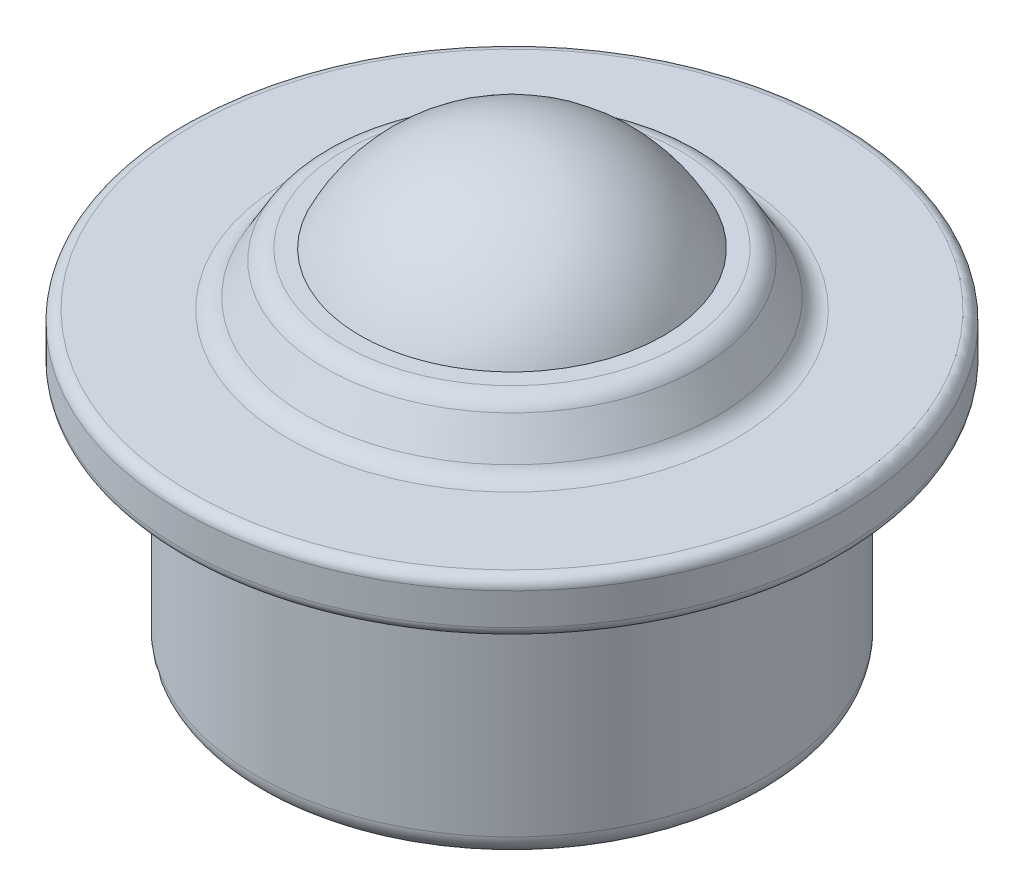
ISO-10303-21;
HEADER;
FILE_DESCRIPTION(('STEP AP214'),'2;1');
FILE_NAME('part.step','',(''),(''),'','','');
FILE_SCHEMA(('AUTOMOTIVE_DESIGN { 1 0 10303 214 1 1 1 1 }'));
ENDSEC;
DATA;
#1=APPLICATION_CONTEXT('core data for automotive mechanical design processes');
#2=APPLICATION_PROTOCOL_DEFINITION('international standard','automotive_design',2000,#1);
#3=PRODUCT_CONTEXT('',#1,'mechanical');
#4=PRODUCT('Part','Part','',(#3));
#5=PRODUCT_RELATED_PRODUCT_CATEGORY('part','',(#4));
#6=PRODUCT_DEFINITION_FORMATION('','',#4);
#7=PRODUCT_DEFINITION_CONTEXT('part definition',#1,'design');
#8=PRODUCT_DEFINITION('design','',#6,#7);
#9=PRODUCT_DEFINITION_SHAPE('','',#8);
#10=(LENGTH_UNIT() NAMED_UNIT(*) SI_UNIT(.MILLI.,.METRE.));
#11=(NAMED_UNIT(*) PLANE_ANGLE_UNIT() SI_UNIT($,.RADIAN.));
#12=(NAMED_UNIT(*) SI_UNIT($,.STERADIAN.) SOLID_ANGLE_UNIT());
#13=UNCERTAINTY_MEASURE_WITH_UNIT(LENGTH_MEASURE(1.E-05),#10,'distance_accuracy_value','');
#14=(GEOMETRIC_REPRESENTATION_CONTEXT(3) GLOBAL_UNCERTAINTY_ASSIGNED_CONTEXT((#13)) GLOBAL_UNIT_ASSIGNED_CONTEXT((#10,
#11,#12)) REPRESENTATION_CONTEXT('',''));
#15=CARTESIAN_POINT('',(0.,0.,0.));
#16=DIRECTION('',(0.,0.,1.));
#17=DIRECTION('',(1.,0.,0.));
#18=AXIS2_PLACEMENT_3D('',#15,#16,#17);
#19=CARTESIAN_POINT('',(0.,11.5,0.));
#20=DIRECTION('',(0.,-1.,0.));
#21=DIRECTION('',(0.,0.,-1.));
#22=AXIS2_PLACEMENT_3D('',#19,#20,#21);
#23=PLANE('',#22);
#24=CARTESIAN_POINT('',(0.,11.5,0.));
#25=DIRECTION('',(0.,-1.,0.));
#26=DIRECTION('',(0.,0.,-1.));
#27=AXIS2_PLACEMENT_3D('',#24,#25,#26);
#28=CIRCLE('',#27,15.);
#29=CARTESIAN_POINT('',(0.,11.5,-15.));
#30=VERTEX_POINT('',#29);
#31=EDGE_CURVE('E71',#30,#30,#28,.T.);
#32=ORIENTED_EDGE('',*,*,#31,.T.);
#33=EDGE_LOOP('',(#32));
#34=FACE_BOUND('',#33,.T.);
#35=CARTESIAN_POINT('',(0.,11.5,0.));
#36=DIRECTION('',(0.,-1.,0.));
#37=DIRECTION('',(0.,0.,-1.));
#38=AXIS2_PLACEMENT_3D('',#35,#36,#37);
#39=CIRCLE('',#38,12.);
#40=CARTESIAN_POINT('',(0.,11.5,-12.));
#41=VERTEX_POINT('',#40);
#42=EDGE_CURVE('E231',#41,#41,#39,.T.);
#43=ORIENTED_EDGE('',*,*,#42,.F.);
#44=EDGE_LOOP('',(#43));
#45=FACE_BOUND('',#44,.T.);
#46=ADVANCED_FACE('F42',(#34,#45),#23,.T.);
#47=CARTESIAN_POINT('',(0.,13.1,0.));
#48=DIRECTION('',(0.275025484031661,0.22901575812674,0.933762692370383));
#49=DIRECTION('',(-0.209422371492755,-0.933625492429608,0.290664256839267));
#50=AXIS2_PLACEMENT_3D('',#47,#48,#49);
#51=SPHERICAL_SURFACE('',#50,7.90000000000001);
#52=CARTESIAN_POINT('',(0.,16.5,0.));
#53=DIRECTION('',(0.,1.,0.));
#54=DIRECTION('',(1.,0.,0.));
#55=AXIS2_PLACEMENT_3D('',#52,#53,#54);
#56=CIRCLE('',#55,7.13091859440283);
#57=CARTESIAN_POINT('',(7.13091859440283,16.5,0.));
#58=VERTEX_POINT('',#57);
#59=EDGE_CURVE('E80',#58,#58,#56,.T.);
#60=ORIENTED_EDGE('',*,*,#59,.T.);
#61=EDGE_LOOP('',(#60));
#62=FACE_BOUND('',#61,.T.);
#63=ADVANCED_FACE('F115',(#62),#51,.T.);
#64=CARTESIAN_POINT('',(7.5267841626066,16.5,0.));
#65=DIRECTION('',(0.,1.,0.));
#66=DIRECTION('',(0.,0.,1.));
#67=AXIS2_PLACEMENT_3D('',#64,#65,#66);
#68=PLANE('',#67);
#69=CARTESIAN_POINT('',(0.,16.5,0.));
#70=DIRECTION('',(0.,1.,0.));
#71=DIRECTION('',(0.,0.,1.));
#72=AXIS2_PLACEMENT_3D('',#69,#70,#71);
#73=CIRCLE('',#72,7.92264973081035);
#74=CARTESIAN_POINT('',(0.,16.5,7.92264973081035));
#75=VERTEX_POINT('',#74);
#76=EDGE_CURVE('E11',#75,#75,#73,.T.);
#77=ORIENTED_EDGE('',*,*,#76,.T.);
#78=EDGE_LOOP('',(#77));
#79=FACE_BOUND('',#78,.T.);
#80=ORIENTED_EDGE('',*,*,#59,.F.);
#81=EDGE_LOOP('',(#80));
#82=FACE_BOUND('',#81,.T.);
#83=ADVANCED_FACE('F91',(#79,#82),#68,.T.);
#84=DIRECTION('',(-0.5,0.866025403784439,0.));
#85=VECTOR('',#84,1.);
#86=CARTESIAN_POINT('',(9.22168783648703,15.25,0.));
#87=LINE('',#86,#85);
#88=CARTESIAN_POINT('',(0.,31.2224318643354,0.));
#89=DIRECTION('',(0.,-1.,0.));
#90=AXIS1_PLACEMENT('',#88,#89);
#91=SURFACE_OF_REVOLUTION('',#87,#90);
#92=CARTESIAN_POINT('',(0.,14.5,0.));
#93=DIRECTION('',(0.,-1.,0.));
#94=DIRECTION('',(0.,0.,-1.));
#95=AXIS2_PLACEMENT_3D('',#92,#93,#94);
#96=CIRCLE('',#95,9.65470053837924);
#97=CARTESIAN_POINT('',(0.,14.5,-9.65470053837924));
#98=VERTEX_POINT('',#97);
#99=EDGE_CURVE('E62',#98,#98,#96,.F.);
#100=ORIENTED_EDGE('',*,*,#99,.T.);
#101=EDGE_LOOP('',(#100));
#102=FACE_BOUND('',#101,.T.);
#103=CARTESIAN_POINT('',(0.,16.,0.));
#104=DIRECTION('',(0.,-1.,0.));
#105=DIRECTION('',(0.,0.,-1.));
#106=AXIS2_PLACEMENT_3D('',#103,#104,#105);
#107=CIRCLE('',#106,8.78867513459482);
#108=CARTESIAN_POINT('',(0.,16.,-8.78867513459482));
#109=VERTEX_POINT('',#108);
#110=EDGE_CURVE('E65',#109,#109,#107,.T.);
#111=ORIENTED_EDGE('',*,*,#110,.T.);
#112=EDGE_LOOP('',(#111));
#113=FACE_BOUND('',#112,.T.);
#114=ADVANCED_FACE('F86',(#102,#113),#91,.F.);
#115=CARTESIAN_POINT('',(0.,11.5,0.));
#116=DIRECTION('',(0.,1.,0.));
#117=DIRECTION('',(0.,0.,1.));
#118=AXIS2_PLACEMENT_3D('',#115,#116,#117);
#119=CYLINDRICAL_SURFACE('',#118,15.5);
#120=CARTESIAN_POINT('',(0.,12.,0.));
#121=DIRECTION('',(0.,-1.,0.));
#122=DIRECTION('',(0.,0.,-1.));
#123=AXIS2_PLACEMENT_3D('',#120,#121,#122);
#124=CIRCLE('',#123,15.5);
#125=CARTESIAN_POINT('',(0.,12.,-15.5));
#126=VERTEX_POINT('',#125);
#127=EDGE_CURVE('E74',#126,#126,#124,.F.);
#128=ORIENTED_EDGE('',*,*,#127,.T.);
#129=EDGE_LOOP('',(#128));
#130=FACE_BOUND('',#129,.T.);
#131=CARTESIAN_POINT('',(0.,13.5,0.));
#132=DIRECTION('',(0.,-1.,0.));
#133=DIRECTION('',(0.,0.,-1.));
#134=AXIS2_PLACEMENT_3D('',#131,#132,#133);
#135=CIRCLE('',#134,15.5);
#136=CARTESIAN_POINT('',(0.,13.5,-15.5));
#137=VERTEX_POINT('',#136);
#138=EDGE_CURVE('E77',#137,#137,#135,.T.);
#139=ORIENTED_EDGE('',*,*,#138,.T.);
#140=EDGE_LOOP('',(#139));
#141=FACE_BOUND('',#140,.T.);
#142=ADVANCED_FACE('F90',(#130,#141),#119,.T.);
#143=CARTESIAN_POINT('',(0.,14.,0.));
#144=DIRECTION('',(0.,-1.,0.));
#145=DIRECTION('',(0.,0.,-1.));
#146=AXIS2_PLACEMENT_3D('',#143,#144,#145);
#147=PLANE('',#146);
#148=CARTESIAN_POINT('',(0.,14.,0.));
#149=DIRECTION('',(0.,-1.,0.));
#150=DIRECTION('',(0.,0.,-1.));
#151=AXIS2_PLACEMENT_3D('',#148,#149,#150);
#152=CIRCLE('',#151,10.5207259421637);
#153=CARTESIAN_POINT('',(0.,14.,-10.5207259421637));
#154=VERTEX_POINT('',#153);
#155=EDGE_CURVE('E57',#154,#154,#152,.T.);
#156=ORIENTED_EDGE('',*,*,#155,.T.);
#157=EDGE_LOOP('',(#156));
#158=FACE_BOUND('',#157,.T.);
#159=CARTESIAN_POINT('',(0.,14.,0.));
#160=DIRECTION('',(0.,-1.,0.));
#161=DIRECTION('',(0.,0.,-1.));
#162=AXIS2_PLACEMENT_3D('',#159,#160,#161);
#163=CIRCLE('',#162,15.);
#164=CARTESIAN_POINT('',(0.,14.,-15.));
#165=VERTEX_POINT('',#164);
#166=EDGE_CURVE('E68',#165,#165,#163,.F.);
#167=ORIENTED_EDGE('',*,*,#166,.T.);
#168=EDGE_LOOP('',(#167));
#169=FACE_BOUND('',#168,.T.);
#170=ADVANCED_FACE('F127',(#158,#169),#147,.F.);
#171=CARTESIAN_POINT('',(0.,0.,0.));
#172=DIRECTION('',(0.,1.,0.));
#173=DIRECTION('',(0.,0.,1.));
#174=AXIS2_PLACEMENT_3D('',#171,#172,#173);
#175=CYLINDRICAL_SURFACE('',#174,12.);
#176=CARTESIAN_POINT('',(0.,1.00000000000004,0.));
#177=DIRECTION('',(0.,-1.,0.));
#178=DIRECTION('',(0.,0.,-1.));
#179=AXIS2_PLACEMENT_3D('',#176,#177,#178);
#180=CIRCLE('',#179,12.);
#181=CARTESIAN_POINT('',(0.,1.00000000000004,-12.));
#182=VERTEX_POINT('',#181);
#183=EDGE_CURVE('E49',#182,#182,#180,.F.);
#184=ORIENTED_EDGE('',*,*,#183,.T.);
#185=EDGE_LOOP('',(#184));
#186=FACE_BOUND('',#185,.T.);
#187=ORIENTED_EDGE('',*,*,#42,.T.);
#188=EDGE_LOOP('',(#187));
#189=FACE_BOUND('',#188,.T.);
#190=ADVANCED_FACE('F125',(#186,#189),#175,.T.);
#191=CARTESIAN_POINT('',(0.,0.,0.));
#192=DIRECTION('',(0.,-1.,0.));
#193=DIRECTION('',(0.,0.,-1.));
#194=AXIS2_PLACEMENT_3D('',#191,#192,#193);
#195=PLANE('',#194);
#196=CARTESIAN_POINT('',(0.,0.,0.));
#197=DIRECTION('',(0.,-1.,0.));
#198=DIRECTION('',(0.,0.,-1.));
#199=AXIS2_PLACEMENT_3D('',#196,#197,#198);
#200=CIRCLE('',#199,11.);
#201=CARTESIAN_POINT('',(0.,0.,-11.));
#202=VERTEX_POINT('',#201);
#203=EDGE_CURVE('E53',#202,#202,#200,.T.);
#204=ORIENTED_EDGE('',*,*,#203,.T.);
#205=EDGE_LOOP('',(#204));
#206=FACE_BOUND('',#205,.T.);
#207=ADVANCED_FACE('F98',(#206),#195,.T.);
#208=CARTESIAN_POINT('',(0.,12.,0.));
#209=DIRECTION('',(0.,-1.,0.));
#210=DIRECTION('',(0.,0.,-1.));
#211=AXIS2_PLACEMENT_3D('',#208,#209,#210);
#212=TOROIDAL_SURFACE('',#211,15.,0.500000000000003);
#213=ORIENTED_EDGE('',*,*,#31,.F.);
#214=EDGE_LOOP('',(#213));
#215=FACE_BOUND('',#214,.T.);
#216=ORIENTED_EDGE('',*,*,#127,.F.);
#217=EDGE_LOOP('',(#216));
#218=FACE_BOUND('',#217,.T.);
#219=ADVANCED_FACE('F94',(#215,#218),#212,.T.);
#220=CARTESIAN_POINT('',(0.,13.5,0.));
#221=DIRECTION('',(0.,-1.,0.));
#222=DIRECTION('',(0.,0.,-1.));
#223=AXIS2_PLACEMENT_3D('',#220,#221,#222);
#224=TOROIDAL_SURFACE('',#223,15.,0.500000000000003);
#225=ORIENTED_EDGE('',*,*,#138,.F.);
#226=EDGE_LOOP('',(#225));
#227=FACE_BOUND('',#226,.T.);
#228=ORIENTED_EDGE('',*,*,#166,.F.);
#229=EDGE_LOOP('',(#228));
#230=FACE_BOUND('',#229,.T.);
#231=ADVANCED_FACE('F97',(#227,#230),#224,.T.);
#232=CARTESIAN_POINT('',(0.,15.,0.));
#233=DIRECTION('',(0.,-1.,0.));
#234=DIRECTION('',(0.,0.,-1.));
#235=AXIS2_PLACEMENT_3D('',#232,#233,#234);
#236=TOROIDAL_SURFACE('',#235,10.5207259421637,1.00000000000004);
#237=ORIENTED_EDGE('',*,*,#155,.F.);
#238=EDGE_LOOP('',(#237));
#239=FACE_BOUND('',#238,.T.);
#240=ORIENTED_EDGE('',*,*,#99,.F.);
#241=EDGE_LOOP('',(#240));
#242=FACE_BOUND('',#241,.T.);
#243=ADVANCED_FACE('F102',(#239,#242),#236,.F.);
#244=CARTESIAN_POINT('',(0.,1.00000000000004,0.));
#245=DIRECTION('',(0.,-1.,0.));
#246=DIRECTION('',(0.,0.,-1.));
#247=AXIS2_PLACEMENT_3D('',#244,#245,#246);
#248=TOROIDAL_SURFACE('',#247,11.,1.00000000000004);
#249=ORIENTED_EDGE('',*,*,#183,.F.);
#250=EDGE_LOOP('',(#249));
#251=FACE_BOUND('',#250,.T.);
#252=ORIENTED_EDGE('',*,*,#203,.F.);
#253=EDGE_LOOP('',(#252));
#254=FACE_BOUND('',#253,.T.);
#255=ADVANCED_FACE('F105',(#251,#254),#248,.T.);
#256=CARTESIAN_POINT('',(0.,15.5,0.));
#257=DIRECTION('',(0.,-1.,0.));
#258=DIRECTION('',(0.,0.,-1.));
#259=AXIS2_PLACEMENT_3D('',#256,#257,#258);
#260=TOROIDAL_SURFACE('',#259,7.92264973081035,1.00000000000004);
#261=ORIENTED_EDGE('',*,*,#76,.F.);
#262=EDGE_LOOP('',(#261));
#263=FACE_BOUND('',#262,.T.);
#264=ORIENTED_EDGE('',*,*,#110,.F.);
#265=EDGE_LOOP('',(#264));
#266=FACE_BOUND('',#265,.T.);
#267=ADVANCED_FACE('F44',(#263,#266),#260,.T.);
#268=CLOSED_SHELL('',(#46,#63,#83,#114,#142,#170,#190,#207,#219,#231,#243,#255,#267));
#269=MANIFOLD_SOLID_BREP('B2',#268);
#270=ADVANCED_BREP_SHAPE_REPRESENTATION('',(#18,#269),#14);
#271=SHAPE_DEFINITION_REPRESENTATION(#9,#270);
ENDSEC;
END-ISO-10303-21;
